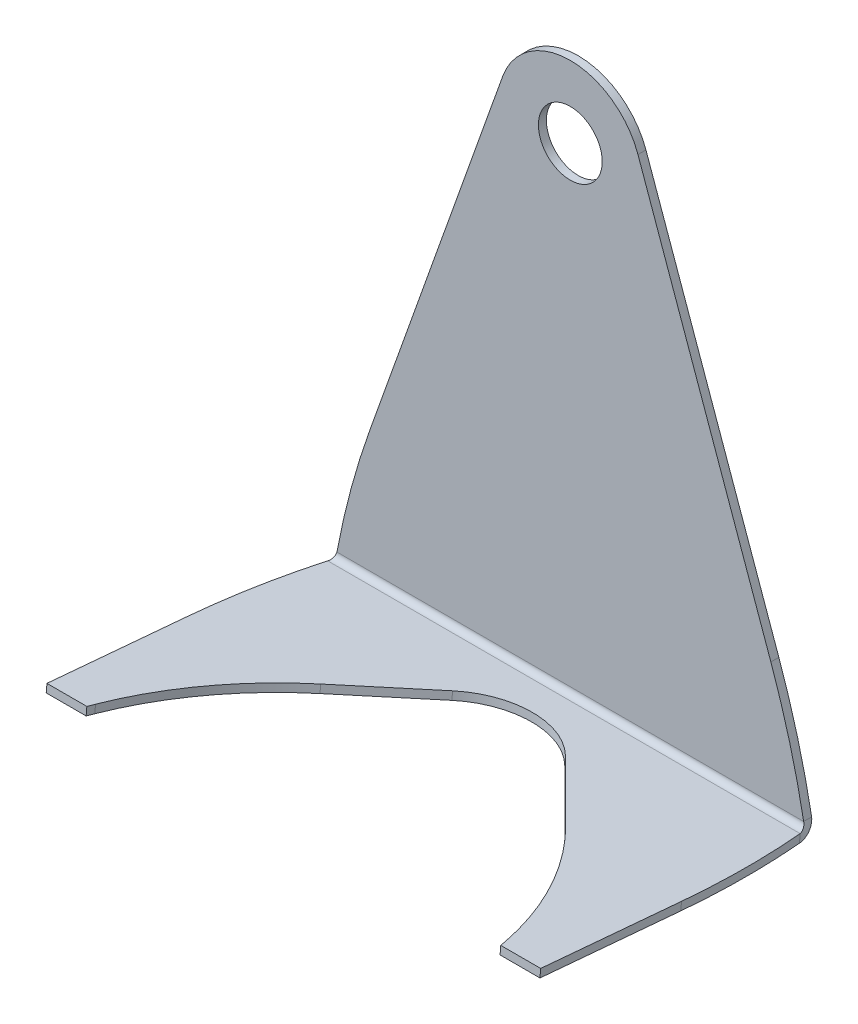
ISO-10303-21;
HEADER;
FILE_DESCRIPTION(('STEP AP214'),'2;1');
FILE_NAME('part.step','',(''),(''),'','','');
FILE_SCHEMA(('AUTOMOTIVE_DESIGN { 1 0 10303 214 1 1 1 1 }'));
ENDSEC;
DATA;
#1=APPLICATION_CONTEXT('core data for automotive mechanical design processes');
#2=APPLICATION_PROTOCOL_DEFINITION('international standard','automotive_design',2000,#1);
#3=PRODUCT_CONTEXT('',#1,'mechanical');
#4=PRODUCT('Part','Part','',(#3));
#5=PRODUCT_RELATED_PRODUCT_CATEGORY('part','',(#4));
#6=PRODUCT_DEFINITION_FORMATION('','',#4);
#7=PRODUCT_DEFINITION_CONTEXT('part definition',#1,'design');
#8=PRODUCT_DEFINITION('design','',#6,#7);
#9=PRODUCT_DEFINITION_SHAPE('','',#8);
#10=(LENGTH_UNIT() NAMED_UNIT(*) SI_UNIT(.MILLI.,.METRE.));
#11=(NAMED_UNIT(*) PLANE_ANGLE_UNIT() SI_UNIT($,.RADIAN.));
#12=(NAMED_UNIT(*) SI_UNIT($,.STERADIAN.) SOLID_ANGLE_UNIT());
#13=UNCERTAINTY_MEASURE_WITH_UNIT(LENGTH_MEASURE(1.E-05),#10,'distance_accuracy_value','');
#14=(GEOMETRIC_REPRESENTATION_CONTEXT(3) GLOBAL_UNCERTAINTY_ASSIGNED_CONTEXT((#13)) GLOBAL_UNIT_ASSIGNED_CONTEXT((#10,
#11,#12)) REPRESENTATION_CONTEXT('',''));
#15=CARTESIAN_POINT('',(0.,0.,0.));
#16=DIRECTION('',(0.,0.,1.));
#17=DIRECTION('',(1.,0.,0.));
#18=AXIS2_PLACEMENT_3D('',#15,#16,#17);
#19=CARTESIAN_POINT('',(0.,-65.0273117005495,-59.9921620678218));
#20=DIRECTION('',(0.,0.996194698091745,-0.0871557427476618));
#21=DIRECTION('',(1.,0.,0.));
#22=AXIS2_PLACEMENT_3D('',#19,#20,#21);
#23=PLANE('',#22);
#24=CARTESIAN_POINT('',(-69.0664990067316,-58.2915841524877,16.9975561036726));
#25=DIRECTION('',(0.,0.996194698091745,-0.0871557427476618));
#26=DIRECTION('',(1.,0.,0.));
#27=AXIS2_PLACEMENT_3D('',#24,#25,#26);
#28=CIRCLE('',#27,100.);
#29=CARTESIAN_POINT('',(30.9335009932684,-58.2915841524876,16.9975561036726));
#30=VERTEX_POINT('',#29);
#31=CARTESIAN_POINT('',(29.6029343312348,-59.7086167919317,0.80079892010794));
#32=VERTEX_POINT('',#31);
#33=EDGE_CURVE('E76',#30,#32,#28,.T.);
#34=ORIENTED_EDGE('',*,*,#33,.T.);
#35=DIRECTION('',(-1.,0.,0.));
#36=VECTOR('',#35,1.);
#37=CARTESIAN_POINT('',(0.,-59.7086167919317,0.800798920107933));
#38=LINE('',#37,#36);
#39=CARTESIAN_POINT('',(-29.6029343312348,-59.7086167919317,0.800798920107926));
#40=VERTEX_POINT('',#39);
#41=EDGE_CURVE('E69',#32,#40,#38,.T.);
#42=ORIENTED_EDGE('',*,*,#41,.T.);
#43=CARTESIAN_POINT('',(69.0664990067316,-58.2915841524876,16.9975561036726));
#44=DIRECTION('',(0.,0.996194698091745,-0.0871557427476618));
#45=DIRECTION('',(1.,0.,0.));
#46=AXIS2_PLACEMENT_3D('',#43,#44,#45);
#47=CIRCLE('',#46,100.);
#48=CARTESIAN_POINT('',(-30.9335009932684,-58.2915841524877,16.9975561036725));
#49=VERTEX_POINT('',#48);
#50=EDGE_CURVE('E83',#40,#49,#47,.T.);
#51=ORIENTED_EDGE('',*,*,#50,.T.);
#52=DIRECTION('',(0.,0.0871557427476618,0.996194698091745));
#53=VECTOR('',#52,1.);
#54=CARTESIAN_POINT('',(-30.9335009932684,-59.7979671356898,-0.220480182317087));
#55=LINE('',#54,#53);
#56=CARTESIAN_POINT('',(-30.9335009932684,-56.7475161395217,34.646334250894));
#57=VERTEX_POINT('',#56);
#58=EDGE_CURVE('E433',#49,#57,#55,.T.);
#59=ORIENTED_EDGE('',*,*,#58,.T.);
#60=DIRECTION('',(1.,0.,0.));
#61=VECTOR('',#60,1.);
#62=CARTESIAN_POINT('',(-30.9335009932684,-56.7475161395217,34.646334250894));
#63=LINE('',#62,#61);
#64=CARTESIAN_POINT('',(-25.9335009932684,-56.7475161395217,34.646334250894));
#65=VERTEX_POINT('',#64);
#66=EDGE_CURVE('E435',#57,#65,#63,.T.);
#67=ORIENTED_EDGE('',*,*,#66,.T.);
#68=DIRECTION('',(0.258819045102519,-0.0841859828293726,-0.962250186899058));
#69=VECTOR('',#68,1.);
#70=CARTESIAN_POINT('',(-25.9335009932684,-56.7475161395217,34.646334250894));
#71=LINE('',#70,#69);
#72=CARTESIAN_POINT('',(-25.702946352975,-56.8225085690057,33.7891668595807));
#73=VERTEX_POINT('',#72);
#74=EDGE_CURVE('E438',#65,#73,#71,.T.);
#75=ORIENTED_EDGE('',*,*,#74,.T.);
#76=CARTESIAN_POINT('',(12.9340866985877,-55.9202059244796,44.1025332794326));
#77=DIRECTION('',(0.,0.996194698091745,-0.0871557427476618));
#78=DIRECTION('',(1.,0.,0.));
#79=AXIS2_PLACEMENT_3D('',#76,#77,#78);
#80=CIRCLE('',#79,40.);
#81=CARTESIAN_POINT('',(-15.3501845488743,-58.3853425931285,15.9258922233223));
#82=VERTEX_POINT('',#81);
#83=EDGE_CURVE('E487',#73,#82,#80,.F.);
#84=ORIENTED_EDGE('',*,*,#83,.T.);
#85=DIRECTION('',(0.707106781186546,-0.0616284167162219,-0.70441602640276));
#86=VECTOR('',#85,1.);
#87=CARTESIAN_POINT('',(-7.07106781186549,-59.1069151616371,7.67828002503152));
#88=LINE('',#87,#86);
#89=CARTESIAN_POINT('',(-7.07106781186549,-59.1069151616371,7.67828002503152));
#90=VERTEX_POINT('',#89);
#91=EDGE_CURVE('E441',#82,#90,#88,.T.);
#92=ORIENTED_EDGE('',*,*,#91,.T.);
#93=CARTESIAN_POINT('',(0.,-58.4906309944749,14.7224402890591));
#94=DIRECTION('',(0.,-0.996194698091745,0.0871557427476618));
#95=DIRECTION('',(1.,0.,0.));
#96=AXIS2_PLACEMENT_3D('',#93,#94,#95);
#97=CIRCLE('',#96,10.);
#98=CARTESIAN_POINT('',(7.07106781186549,-59.1069151616371,7.67828002503152));
#99=VERTEX_POINT('',#98);
#100=EDGE_CURVE('E443',#90,#99,#97,.T.);
#101=ORIENTED_EDGE('',*,*,#100,.T.);
#102=DIRECTION('',(0.707106781186546,0.0616284167162222,0.70441602640276));
#103=VECTOR('',#102,1.);
#104=CARTESIAN_POINT('',(22.9289321881345,-57.7248112135317,23.4758004397287));
#105=LINE('',#104,#103);
#106=CARTESIAN_POINT('',(15.3501845488743,-58.3853425931285,15.9258922233223));
#107=VERTEX_POINT('',#106);
#108=EDGE_CURVE('E446',#99,#107,#105,.T.);
#109=ORIENTED_EDGE('',*,*,#108,.T.);
#110=CARTESIAN_POINT('',(-12.9340866985877,-55.9202059244796,44.1025332794326));
#111=DIRECTION('',(0.,0.996194698091745,-0.0871557427476618));
#112=DIRECTION('',(1.,0.,0.));
#113=AXIS2_PLACEMENT_3D('',#110,#111,#112);
#114=CIRCLE('',#113,40.);
#115=CARTESIAN_POINT('',(25.702946352975,-56.8225085690056,33.7891668595807));
#116=VERTEX_POINT('',#115);
#117=EDGE_CURVE('E483',#107,#116,#114,.F.);
#118=ORIENTED_EDGE('',*,*,#117,.T.);
#119=DIRECTION('',(0.258819045102519,0.0841859828293728,0.962250186899058));
#120=VECTOR('',#119,1.);
#121=CARTESIAN_POINT('',(22.9289321881345,-57.7248112135317,23.4758004397287));
#122=LINE('',#121,#120);
#123=CARTESIAN_POINT('',(25.9335009932684,-56.7475161395216,34.646334250894));
#124=VERTEX_POINT('',#123);
#125=EDGE_CURVE('E449',#116,#124,#122,.T.);
#126=ORIENTED_EDGE('',*,*,#125,.T.);
#127=DIRECTION('',(1.,0.,0.));
#128=VECTOR('',#127,1.);
#129=CARTESIAN_POINT('',(25.9335009932684,-56.7475161395216,34.646334250894));
#130=LINE('',#129,#128);
#131=CARTESIAN_POINT('',(30.9335009932684,-56.7475161395216,34.646334250894));
#132=VERTEX_POINT('',#131);
#133=EDGE_CURVE('E451',#124,#132,#130,.T.);
#134=ORIENTED_EDGE('',*,*,#133,.T.);
#135=DIRECTION('',(0.,-0.0871557427476618,-0.996194698091745));
#136=VECTOR('',#135,1.);
#137=CARTESIAN_POINT('',(30.9335009932684,-56.7475161395216,34.646334250894));
#138=LINE('',#137,#136);
#139=EDGE_CURVE('E410',#132,#30,#138,.T.);
#140=ORIENTED_EDGE('',*,*,#139,.T.);
#141=EDGE_LOOP('',(#34,#42,#51,#59,#67,#75,#84,#92,#101,#109,#118,#126,#134,#140));
#142=FACE_BOUND('',#141,.T.);
#143=ADVANCED_FACE('F57',(#142),#23,.T.);
#144=CARTESIAN_POINT('',(69.0664990067316,-59.2877788505794,17.0847118464202));
#145=DIRECTION('',(0.,0.996194698091745,-0.0871557427476618));
#146=DIRECTION('',(1.,0.,0.));
#147=AXIS2_PLACEMENT_3D('',#144,#145,#146);
#148=CYLINDRICAL_SURFACE('',#147,100.);
#149=ORIENTED_EDGE('',*,*,#50,.F.);
#150=CARTESIAN_POINT('',(-29.6029343312348,-60.7048114900234,0.887954662855561));
#151=CARTESIAN_POINT('',(-29.6029343312348,-59.7086167919317,0.800798920107916));
#152=B_SPLINE_CURVE_WITH_KNOTS('',1,(#150,#151),.UNSPECIFIED.,.F.,.F.,(2,2),(0.,1.),.UNSPECIFIED.);
#153=CARTESIAN_POINT('',(-29.6029343312348,-60.7048114900234,0.887954662855592));
#154=VERTEX_POINT('',#153);
#155=EDGE_CURVE('E196',#40,#154,#152,.F.);
#156=ORIENTED_EDGE('',*,*,#155,.T.);
#157=CARTESIAN_POINT('',(69.0664990067316,-59.2877788505794,17.0847118464202));
#158=DIRECTION('',(0.,0.996194698091745,-0.0871557427476618));
#159=DIRECTION('',(1.,0.,0.));
#160=AXIS2_PLACEMENT_3D('',#157,#158,#159);
#161=CIRCLE('',#160,100.);
#162=CARTESIAN_POINT('',(-30.9335009932684,-59.2877788505794,17.0847118464202));
#163=VERTEX_POINT('',#162);
#164=EDGE_CURVE('E199',#163,#154,#161,.F.);
#165=ORIENTED_EDGE('',*,*,#164,.F.);
#166=DIRECTION('',(0.,0.996194698091745,-0.0871557427476618));
#167=VECTOR('',#166,1.);
#168=CARTESIAN_POINT('',(-30.9335009932684,-59.2877788505794,17.0847118464202));
#169=LINE('',#168,#167);
#170=EDGE_CURVE('E469',#49,#163,#169,.F.);
#171=ORIENTED_EDGE('',*,*,#170,.F.);
#172=EDGE_LOOP('',(#149,#156,#165,#171));
#173=FACE_BOUND('',#172,.T.);
#174=ADVANCED_FACE('F198',(#173),#148,.T.);
#175=CARTESIAN_POINT('',(-69.0664990067316,-59.2877788505794,17.0847118464202));
#176=DIRECTION('',(0.,0.996194698091745,-0.0871557427476618));
#177=DIRECTION('',(1.,0.,0.));
#178=AXIS2_PLACEMENT_3D('',#175,#176,#177);
#179=CYLINDRICAL_SURFACE('',#178,100.);
#180=CARTESIAN_POINT('',(-69.0664990067316,-59.2877788505794,17.0847118464202));
#181=DIRECTION('',(0.,0.996194698091745,-0.0871557427476618));
#182=DIRECTION('',(1.,0.,0.));
#183=AXIS2_PLACEMENT_3D('',#180,#181,#182);
#184=CIRCLE('',#183,100.);
#185=CARTESIAN_POINT('',(29.6029343312348,-60.7048114900234,0.887954662855586));
#186=VERTEX_POINT('',#185);
#187=CARTESIAN_POINT('',(30.9335009932684,-59.2877788505794,17.0847118464202));
#188=VERTEX_POINT('',#187);
#189=EDGE_CURVE('E215',#186,#188,#184,.F.);
#190=ORIENTED_EDGE('',*,*,#189,.F.);
#191=CARTESIAN_POINT('',(29.6029343312348,-59.7086167919317,0.800798920107929));
#192=CARTESIAN_POINT('',(29.6029343312348,-60.7048114900234,0.887954662855592));
#193=B_SPLINE_CURVE_WITH_KNOTS('',1,(#191,#192),.UNSPECIFIED.,.F.,.F.,(2,2),(0.,1.),.UNSPECIFIED.);
#194=EDGE_CURVE('E12',#186,#32,#193,.F.);
#195=ORIENTED_EDGE('',*,*,#194,.T.);
#196=ORIENTED_EDGE('',*,*,#33,.F.);
#197=DIRECTION('',(0.,0.996194698091745,-0.0871557427476618));
#198=VECTOR('',#197,1.);
#199=CARTESIAN_POINT('',(30.9335009932684,-59.2877788505794,17.0847118464202));
#200=LINE('',#199,#198);
#201=EDGE_CURVE('E214',#188,#30,#200,.T.);
#202=ORIENTED_EDGE('',*,*,#201,.F.);
#203=EDGE_LOOP('',(#190,#195,#196,#202));
#204=FACE_BOUND('',#203,.T.);
#205=ADVANCED_FACE('F59',(#204),#179,.T.);
#206=CARTESIAN_POINT('',(30.9335009932684,-57.7437108376134,34.7334899936417));
#207=DIRECTION('',(1.,0.,0.));
#208=DIRECTION('',(0.,-0.996194698091745,0.0871557427476618));
#209=AXIS2_PLACEMENT_3D('',#206,#207,#208);
#210=PLANE('',#209);
#211=DIRECTION('',(0.,-0.0871557427476618,-0.996194698091745));
#212=VECTOR('',#211,1.);
#213=CARTESIAN_POINT('',(30.9335009932684,-57.7437108376134,34.7334899936417));
#214=LINE('',#213,#212);
#215=CARTESIAN_POINT('',(30.9335009932684,-57.7437108376134,34.7334899936417));
#216=VERTEX_POINT('',#215);
#217=EDGE_CURVE('E429',#216,#188,#214,.T.);
#218=ORIENTED_EDGE('',*,*,#217,.T.);
#219=ORIENTED_EDGE('',*,*,#201,.T.);
#220=ORIENTED_EDGE('',*,*,#139,.F.);
#221=DIRECTION('',(0.,0.996194698091745,-0.0871557427476618));
#222=VECTOR('',#221,1.);
#223=CARTESIAN_POINT('',(30.9335009932684,-57.7437108376134,34.7334899936417));
#224=LINE('',#223,#222);
#225=EDGE_CURVE('E455',#216,#132,#224,.T.);
#226=ORIENTED_EDGE('',*,*,#225,.F.);
#227=EDGE_LOOP('',(#218,#219,#220,#226));
#228=FACE_BOUND('',#227,.T.);
#229=ADVANCED_FACE('F392',(#228),#210,.T.);
#230=CARTESIAN_POINT('',(25.9335009932684,-57.7437108376134,34.7334899936417));
#231=DIRECTION('',(0.,0.0871557427476618,0.996194698091745));
#232=DIRECTION('',(1.,0.,0.));
#233=AXIS2_PLACEMENT_3D('',#230,#231,#232);
#234=PLANE('',#233);
#235=ORIENTED_EDGE('',*,*,#133,.F.);
#236=DIRECTION('',(0.,0.996194698091745,-0.0871557427476618));
#237=VECTOR('',#236,1.);
#238=CARTESIAN_POINT('',(25.9335009932684,-57.7437108376134,34.7334899936417));
#239=LINE('',#238,#237);
#240=CARTESIAN_POINT('',(25.9335009932684,-57.7437108376134,34.7334899936417));
#241=VERTEX_POINT('',#240);
#242=EDGE_CURVE('E457',#241,#124,#239,.T.);
#243=ORIENTED_EDGE('',*,*,#242,.F.);
#244=DIRECTION('',(1.,0.,0.));
#245=VECTOR('',#244,1.);
#246=CARTESIAN_POINT('',(25.9335009932684,-57.7437108376134,34.7334899936417));
#247=LINE('',#246,#245);
#248=EDGE_CURVE('E426',#241,#216,#247,.T.);
#249=ORIENTED_EDGE('',*,*,#248,.T.);
#250=ORIENTED_EDGE('',*,*,#225,.T.);
#251=EDGE_LOOP('',(#235,#243,#249,#250));
#252=FACE_BOUND('',#251,.T.);
#253=ADVANCED_FACE('F558',(#252),#234,.T.);
#254=CARTESIAN_POINT('',(22.9289321881345,-58.7210059116234,23.5629561824764));
#255=DIRECTION('',(-0.965925826289069,0.0225575661131504,0.257834160496298));
#256=DIRECTION('',(0.258819045102519,0.0841859828293728,0.962250186899058));
#257=AXIS2_PLACEMENT_3D('',#254,#255,#256);
#258=PLANE('',#257);
#259=ORIENTED_EDGE('',*,*,#125,.F.);
#260=DIRECTION('',(0.,0.996194698091745,-0.0871557427476618));
#261=VECTOR('',#260,1.);
#262=CARTESIAN_POINT('',(25.702946352975,-57.8187032670974,33.8763226023283));
#263=LINE('',#262,#261);
#264=CARTESIAN_POINT('',(25.702946352975,-57.8187032670974,33.8763226023283));
#265=VERTEX_POINT('',#264);
#266=EDGE_CURVE('E476',#116,#265,#263,.F.);
#267=ORIENTED_EDGE('',*,*,#266,.T.);
#268=DIRECTION('',(0.258819045102519,0.0841859828293728,0.962250186899058));
#269=VECTOR('',#268,1.);
#270=CARTESIAN_POINT('',(22.9289321881345,-58.7210059116234,23.5629561824764));
#271=LINE('',#270,#269);
#272=EDGE_CURVE('E424',#265,#241,#271,.T.);
#273=ORIENTED_EDGE('',*,*,#272,.T.);
#274=ORIENTED_EDGE('',*,*,#242,.T.);
#275=EDGE_LOOP('',(#259,#267,#273,#274));
#276=FACE_BOUND('',#275,.T.);
#277=ADVANCED_FACE('F552',(#276),#258,.T.);
#278=CARTESIAN_POINT('',(22.9289321881345,-58.7210059116234,23.5629561824764));
#279=DIRECTION('',(-0.70710678118655,0.0616284167162216,0.704416026402757));
#280=DIRECTION('',(0.707106781186546,0.0616284167162222,0.70441602640276));
#281=AXIS2_PLACEMENT_3D('',#278,#279,#280);
#282=PLANE('',#281);
#283=DIRECTION('',(0.707106781186546,0.0616284167162222,0.70441602640276));
#284=VECTOR('',#283,1.);
#285=CARTESIAN_POINT('',(22.9289321881345,-58.7210059116234,23.5629561824764));
#286=LINE('',#285,#284);
#287=CARTESIAN_POINT('',(7.07106781186549,-60.1031098597288,7.76543576777918));
#288=VERTEX_POINT('',#287);
#289=CARTESIAN_POINT('',(15.3501845488743,-59.3815372912202,16.01304796607));
#290=VERTEX_POINT('',#289);
#291=EDGE_CURVE('E421',#288,#290,#286,.T.);
#292=ORIENTED_EDGE('',*,*,#291,.T.);
#293=DIRECTION('',(0.,0.996194698091745,-0.0871557427476618));
#294=VECTOR('',#293,1.);
#295=CARTESIAN_POINT('',(15.3501845488743,-58.3853425931285,15.9258922233223));
#296=LINE('',#295,#294);
#297=EDGE_CURVE('E473',#290,#107,#296,.T.);
#298=ORIENTED_EDGE('',*,*,#297,.T.);
#299=ORIENTED_EDGE('',*,*,#108,.F.);
#300=DIRECTION('',(0.,0.996194698091745,-0.0871557427476618));
#301=VECTOR('',#300,1.);
#302=CARTESIAN_POINT('',(7.07106781186549,-60.1031098597288,7.76543576777918));
#303=LINE('',#302,#301);
#304=EDGE_CURVE('E460',#288,#99,#303,.T.);
#305=ORIENTED_EDGE('',*,*,#304,.F.);
#306=EDGE_LOOP('',(#292,#298,#299,#305));
#307=FACE_BOUND('',#306,.T.);
#308=ADVANCED_FACE('F544',(#307),#282,.T.);
#309=CARTESIAN_POINT('',(0.,-59.4868256925666,14.8095960318068));
#310=DIRECTION('',(0.,0.996194698091745,-0.0871557427476618));
#311=DIRECTION('',(1.,0.,0.));
#312=AXIS2_PLACEMENT_3D('',#309,#310,#311);
#313=CYLINDRICAL_SURFACE('',#312,10.);
#314=ORIENTED_EDGE('',*,*,#100,.F.);
#315=DIRECTION('',(0.,0.996194698091745,-0.0871557427476618));
#316=VECTOR('',#315,1.);
#317=CARTESIAN_POINT('',(-7.07106781186549,-60.1031098597288,7.76543576777918));
#318=LINE('',#317,#316);
#319=CARTESIAN_POINT('',(-7.07106781186549,-60.1031098597288,7.76543576777918));
#320=VERTEX_POINT('',#319);
#321=EDGE_CURVE('E462',#320,#90,#318,.T.);
#322=ORIENTED_EDGE('',*,*,#321,.F.);
#323=CARTESIAN_POINT('',(0.,-59.4868256925666,14.8095960318068));
#324=DIRECTION('',(0.,-0.996194698091745,0.0871557427476618));
#325=DIRECTION('',(1.,0.,0.));
#326=AXIS2_PLACEMENT_3D('',#323,#324,#325);
#327=CIRCLE('',#326,10.);
#328=EDGE_CURVE('E418',#320,#288,#327,.T.);
#329=ORIENTED_EDGE('',*,*,#328,.T.);
#330=ORIENTED_EDGE('',*,*,#304,.T.);
#331=EDGE_LOOP('',(#314,#322,#329,#330));
#332=FACE_BOUND('',#331,.T.);
#333=ADVANCED_FACE('F540',(#332),#313,.F.);
#334=CARTESIAN_POINT('',(-7.07106781186549,-60.1031098597288,7.76543576777918));
#335=DIRECTION('',(0.707106781186549,0.0616284167162219,0.704416026402757));
#336=DIRECTION('',(0.707106781186546,-0.0616284167162219,-0.70441602640276));
#337=AXIS2_PLACEMENT_3D('',#334,#335,#336);
#338=PLANE('',#337);
#339=ORIENTED_EDGE('',*,*,#91,.F.);
#340=DIRECTION('',(0.,0.996194698091745,-0.0871557427476618));
#341=VECTOR('',#340,1.);
#342=CARTESIAN_POINT('',(-15.3501845488743,-59.3815372912202,16.01304796607));
#343=LINE('',#342,#341);
#344=CARTESIAN_POINT('',(-15.3501845488743,-59.3815372912202,16.01304796607));
#345=VERTEX_POINT('',#344);
#346=EDGE_CURVE('E481',#82,#345,#343,.F.);
#347=ORIENTED_EDGE('',*,*,#346,.T.);
#348=DIRECTION('',(0.707106781186546,-0.0616284167162219,-0.70441602640276));
#349=VECTOR('',#348,1.);
#350=CARTESIAN_POINT('',(-7.07106781186549,-60.1031098597288,7.76543576777918));
#351=LINE('',#350,#349);
#352=EDGE_CURVE('E416',#345,#320,#351,.T.);
#353=ORIENTED_EDGE('',*,*,#352,.T.);
#354=ORIENTED_EDGE('',*,*,#321,.T.);
#355=EDGE_LOOP('',(#339,#347,#353,#354));
#356=FACE_BOUND('',#355,.T.);
#357=ADVANCED_FACE('F534',(#356),#338,.T.);
#358=CARTESIAN_POINT('',(-25.9335009932684,-57.7437108376134,34.7334899936417));
#359=DIRECTION('',(0.965925826289069,0.0225575661131509,0.257834160496298));
#360=DIRECTION('',(0.258819045102519,-0.0841859828293726,-0.962250186899058));
#361=AXIS2_PLACEMENT_3D('',#358,#359,#360);
#362=PLANE('',#361);
#363=DIRECTION('',(0.258819045102519,-0.0841859828293726,-0.962250186899058));
#364=VECTOR('',#363,1.);
#365=CARTESIAN_POINT('',(-25.9335009932684,-57.7437108376134,34.7334899936417));
#366=LINE('',#365,#364);
#367=CARTESIAN_POINT('',(-25.9335009932684,-57.7437108376134,34.7334899936417));
#368=VERTEX_POINT('',#367);
#369=CARTESIAN_POINT('',(-25.702946352975,-57.8187032670974,33.8763226023284));
#370=VERTEX_POINT('',#369);
#371=EDGE_CURVE('E413',#368,#370,#366,.T.);
#372=ORIENTED_EDGE('',*,*,#371,.T.);
#373=DIRECTION('',(0.,0.996194698091745,-0.0871557427476618));
#374=VECTOR('',#373,1.);
#375=CARTESIAN_POINT('',(-25.7029463529751,-56.8225085690057,33.7891668595807));
#376=LINE('',#375,#374);
#377=EDGE_CURVE('E478',#370,#73,#376,.T.);
#378=ORIENTED_EDGE('',*,*,#377,.T.);
#379=ORIENTED_EDGE('',*,*,#74,.F.);
#380=DIRECTION('',(0.,0.996194698091745,-0.0871557427476618));
#381=VECTOR('',#380,1.);
#382=CARTESIAN_POINT('',(-25.9335009932684,-57.7437108376134,34.7334899936417));
#383=LINE('',#382,#381);
#384=EDGE_CURVE('E465',#368,#65,#383,.T.);
#385=ORIENTED_EDGE('',*,*,#384,.F.);
#386=EDGE_LOOP('',(#372,#378,#379,#385));
#387=FACE_BOUND('',#386,.T.);
#388=ADVANCED_FACE('F525',(#387),#362,.T.);
#389=CARTESIAN_POINT('',(-30.9335009932684,-57.7437108376134,34.7334899936416));
#390=DIRECTION('',(0.,0.0871557427476618,0.996194698091745));
#391=DIRECTION('',(0.,-0.996194698091745,0.0871557427476618));
#392=AXIS2_PLACEMENT_3D('',#389,#390,#391);
#393=PLANE('',#392);
#394=ORIENTED_EDGE('',*,*,#66,.F.);
#395=DIRECTION('',(0.,0.996194698091745,-0.0871557427476618));
#396=VECTOR('',#395,1.);
#397=CARTESIAN_POINT('',(-30.9335009932684,-57.7437108376134,34.7334899936416));
#398=LINE('',#397,#396);
#399=CARTESIAN_POINT('',(-30.9335009932684,-57.7437108376134,34.7334899936416));
#400=VERTEX_POINT('',#399);
#401=EDGE_CURVE('E432',#400,#57,#398,.T.);
#402=ORIENTED_EDGE('',*,*,#401,.F.);
#403=DIRECTION('',(1.,0.,0.));
#404=VECTOR('',#403,1.);
#405=CARTESIAN_POINT('',(-30.9335009932684,-57.7437108376134,34.7334899936416));
#406=LINE('',#405,#404);
#407=EDGE_CURVE('E409',#400,#368,#406,.T.);
#408=ORIENTED_EDGE('',*,*,#407,.T.);
#409=ORIENTED_EDGE('',*,*,#384,.T.);
#410=EDGE_LOOP('',(#394,#402,#408,#409));
#411=FACE_BOUND('',#410,.T.);
#412=ADVANCED_FACE('F521',(#411),#393,.T.);
#413=CARTESIAN_POINT('',(-30.9335009932684,-60.7941618337816,-0.133324439569427));
#414=DIRECTION('',(-1.,0.,0.));
#415=DIRECTION('',(0.,0.0871557427476618,0.996194698091745));
#416=AXIS2_PLACEMENT_3D('',#413,#414,#415);
#417=PLANE('',#416);
#418=ORIENTED_EDGE('',*,*,#58,.F.);
#419=ORIENTED_EDGE('',*,*,#170,.T.);
#420=DIRECTION('',(0.,0.0871557427476618,0.996194698091745));
#421=VECTOR('',#420,1.);
#422=CARTESIAN_POINT('',(-30.9335009932684,-60.7941618337816,-0.133324439569427));
#423=LINE('',#422,#421);
#424=EDGE_CURVE('E213',#163,#400,#423,.T.);
#425=ORIENTED_EDGE('',*,*,#424,.T.);
#426=ORIENTED_EDGE('',*,*,#401,.T.);
#427=EDGE_LOOP('',(#418,#419,#425,#426));
#428=FACE_BOUND('',#427,.T.);
#429=ADVANCED_FACE('F517',(#428),#417,.T.);
#430=CARTESIAN_POINT('',(0.,-66.0235063986413,-59.9050063250741));
#431=DIRECTION('',(0.,0.996194698091745,-0.0871557427476618));
#432=DIRECTION('',(1.,0.,0.));
#433=AXIS2_PLACEMENT_3D('',#430,#431,#432);
#434=PLANE('',#433);
#435=DIRECTION('',(-1.,0.,0.));
#436=VECTOR('',#435,1.);
#437=CARTESIAN_POINT('',(0.,-60.7048114900234,0.887954662855586));
#438=LINE('',#437,#436);
#439=EDGE_CURVE('E205',#186,#154,#438,.T.);
#440=ORIENTED_EDGE('',*,*,#439,.F.);
#441=ORIENTED_EDGE('',*,*,#189,.T.);
#442=ORIENTED_EDGE('',*,*,#217,.F.);
#443=ORIENTED_EDGE('',*,*,#248,.F.);
#444=ORIENTED_EDGE('',*,*,#272,.F.);
#445=CARTESIAN_POINT('',(-12.9340866985877,-56.9164006225714,44.1896890221803));
#446=DIRECTION('',(0.,0.996194698091745,-0.0871557427476618));
#447=DIRECTION('',(1.,0.,0.));
#448=AXIS2_PLACEMENT_3D('',#445,#446,#447);
#449=CIRCLE('',#448,40.);
#450=EDGE_CURVE('E485',#265,#290,#449,.T.);
#451=ORIENTED_EDGE('',*,*,#450,.T.);
#452=ORIENTED_EDGE('',*,*,#291,.F.);
#453=ORIENTED_EDGE('',*,*,#328,.F.);
#454=ORIENTED_EDGE('',*,*,#352,.F.);
#455=CARTESIAN_POINT('',(12.9340866985877,-56.9164006225714,44.1896890221803));
#456=DIRECTION('',(0.,0.996194698091745,-0.0871557427476618));
#457=DIRECTION('',(1.,0.,0.));
#458=AXIS2_PLACEMENT_3D('',#455,#456,#457);
#459=CIRCLE('',#458,40.);
#460=EDGE_CURVE('E227',#345,#370,#459,.T.);
#461=ORIENTED_EDGE('',*,*,#460,.T.);
#462=ORIENTED_EDGE('',*,*,#371,.F.);
#463=ORIENTED_EDGE('',*,*,#407,.F.);
#464=ORIENTED_EDGE('',*,*,#424,.F.);
#465=ORIENTED_EDGE('',*,*,#164,.T.);
#466=EDGE_LOOP('',(#440,#441,#442,#443,#444,#451,#452,#453,#454,#461,#462,#463,#464,#465));
#467=FACE_BOUND('',#466,.T.);
#468=ADVANCED_FACE('F210',(#467),#434,.F.);
#469=CARTESIAN_POINT('',(-12.9340866985877,-56.9164006225714,44.1896890221803));
#470=DIRECTION('',(0.,-0.996194698091745,0.0871557427476618));
#471=DIRECTION('',(-1.,0.,0.));
#472=AXIS2_PLACEMENT_3D('',#469,#470,#471);
#473=CYLINDRICAL_SURFACE('',#472,40.);
#474=ORIENTED_EDGE('',*,*,#450,.F.);
#475=ORIENTED_EDGE('',*,*,#266,.F.);
#476=ORIENTED_EDGE('',*,*,#117,.F.);
#477=ORIENTED_EDGE('',*,*,#297,.F.);
#478=EDGE_LOOP('',(#474,#475,#476,#477));
#479=FACE_BOUND('',#478,.T.);
#480=ADVANCED_FACE('F548',(#479),#473,.F.);
#481=CARTESIAN_POINT('',(12.9340866985877,-56.9164006225714,44.1896890221803));
#482=DIRECTION('',(0.,-0.996194698091745,0.0871557427476618));
#483=DIRECTION('',(-1.,0.,0.));
#484=AXIS2_PLACEMENT_3D('',#481,#482,#483);
#485=CYLINDRICAL_SURFACE('',#484,40.);
#486=ORIENTED_EDGE('',*,*,#460,.F.);
#487=ORIENTED_EDGE('',*,*,#346,.F.);
#488=ORIENTED_EDGE('',*,*,#83,.F.);
#489=ORIENTED_EDGE('',*,*,#377,.F.);
#490=EDGE_LOOP('',(#486,#487,#488,#489));
#491=FACE_BOUND('',#490,.T.);
#492=ADVANCED_FACE('F530',(#491),#485,.F.);
#493=CARTESIAN_POINT('',(30.9335009932684,-60.,-1.));
#494=DIRECTION('',(0.941987028632835,0.335649278097663,0.));
#495=DIRECTION('',(-0.335649278097663,0.941987028632835,0.));
#496=AXIS2_PLACEMENT_3D('',#493,#494,#495);
#497=PLANE('',#496);
#498=DIRECTION('',(-0.335649278097663,0.941987028632835,0.));
#499=VECTOR('',#498,1.);
#500=CARTESIAN_POINT('',(30.9335009932684,-60.,0.));
#501=LINE('',#500,#499);
#502=CARTESIAN_POINT('',(25.1322038565519,-43.7188785776513,0.));
#503=VERTEX_POINT('',#502);
#504=CARTESIAN_POINT('',(8.4778832576955,3.02084350287896,0.));
#505=VERTEX_POINT('',#504);
#506=EDGE_CURVE('E326',#503,#505,#501,.T.);
#507=ORIENTED_EDGE('',*,*,#506,.F.);
#508=DIRECTION('',(0.,0.,1.));
#509=VECTOR('',#508,1.);
#510=CARTESIAN_POINT('',(25.1322038565519,-43.7188785776513,-1.));
#511=LINE('',#510,#509);
#512=CARTESIAN_POINT('',(25.1322038565519,-43.7188785776513,-1.));
#513=VERTEX_POINT('',#512);
#514=EDGE_CURVE('E352',#503,#513,#511,.F.);
#515=ORIENTED_EDGE('',*,*,#514,.T.);
#516=DIRECTION('',(-0.335649278097663,0.941987028632835,0.));
#517=VECTOR('',#516,1.);
#518=CARTESIAN_POINT('',(30.9335009932684,-60.,-1.));
#519=LINE('',#518,#517);
#520=CARTESIAN_POINT('',(8.4778832576955,3.02084350287896,-1.));
#521=VERTEX_POINT('',#520);
#522=EDGE_CURVE('E350',#513,#521,#519,.T.);
#523=ORIENTED_EDGE('',*,*,#522,.T.);
#524=DIRECTION('',(0.,0.,1.));
#525=VECTOR('',#524,1.);
#526=CARTESIAN_POINT('',(8.4778832576955,3.02084350287896,-1.));
#527=LINE('',#526,#525);
#528=EDGE_CURVE('E347',#521,#505,#527,.T.);
#529=ORIENTED_EDGE('',*,*,#528,.T.);
#530=EDGE_LOOP('',(#507,#515,#523,#529));
#531=FACE_BOUND('',#530,.T.);
#532=ADVANCED_FACE('F576',(#531),#497,.T.);
#533=CARTESIAN_POINT('',(0.,0.,-1.));
#534=DIRECTION('',(0.,0.,1.));
#535=DIRECTION('',(1.,0.,0.));
#536=AXIS2_PLACEMENT_3D('',#533,#534,#535);
#537=CYLINDRICAL_SURFACE('',#536,8.99999999999999);
#538=CARTESIAN_POINT('',(0.,0.,0.));
#539=DIRECTION('',(0.,0.,1.));
#540=DIRECTION('',(1.,0.,0.));
#541=AXIS2_PLACEMENT_3D('',#538,#539,#540);
#542=CIRCLE('',#541,8.99999999999999);
#543=CARTESIAN_POINT('',(-8.47788325769551,3.02084350287896,0.));
#544=VERTEX_POINT('',#543);
#545=EDGE_CURVE('E323',#505,#544,#542,.T.);
#546=ORIENTED_EDGE('',*,*,#545,.F.);
#547=ORIENTED_EDGE('',*,*,#528,.F.);
#548=CARTESIAN_POINT('',(0.,0.,-1.));
#549=DIRECTION('',(0.,0.,1.));
#550=DIRECTION('',(1.,0.,0.));
#551=AXIS2_PLACEMENT_3D('',#548,#549,#550);
#552=CIRCLE('',#551,8.99999999999999);
#553=CARTESIAN_POINT('',(-8.47788325769551,3.02084350287896,-1.));
#554=VERTEX_POINT('',#553);
#555=EDGE_CURVE('E344',#521,#554,#552,.T.);
#556=ORIENTED_EDGE('',*,*,#555,.T.);
#557=DIRECTION('',(0.,0.,1.));
#558=VECTOR('',#557,1.);
#559=CARTESIAN_POINT('',(-8.47788325769551,3.02084350287896,-1.));
#560=LINE('',#559,#558);
#561=EDGE_CURVE('E342',#554,#544,#560,.T.);
#562=ORIENTED_EDGE('',*,*,#561,.T.);
#563=EDGE_LOOP('',(#546,#547,#556,#562));
#564=FACE_BOUND('',#563,.T.);
#565=ADVANCED_FACE('F643',(#564),#537,.T.);
#566=CARTESIAN_POINT('',(-8.47788325769551,3.02084350287896,-1.));
#567=DIRECTION('',(-0.941987028632835,0.335649278097663,0.));
#568=DIRECTION('',(-0.335649278097663,-0.941987028632835,0.));
#569=AXIS2_PLACEMENT_3D('',#566,#567,#568);
#570=PLANE('',#569);
#571=DIRECTION('',(-0.335649278097663,-0.941987028632835,0.));
#572=VECTOR('',#571,1.);
#573=CARTESIAN_POINT('',(-8.47788325769551,3.02084350287896,-1.));
#574=LINE('',#573,#572);
#575=CARTESIAN_POINT('',(-25.1322038565519,-43.7188785776513,-1.));
#576=VERTEX_POINT('',#575);
#577=EDGE_CURVE('E339',#554,#576,#574,.T.);
#578=ORIENTED_EDGE('',*,*,#577,.T.);
#579=DIRECTION('',(0.,0.,1.));
#580=VECTOR('',#579,1.);
#581=CARTESIAN_POINT('',(-25.1322038565519,-43.7188785776513,-1.));
#582=LINE('',#581,#580);
#583=CARTESIAN_POINT('',(-25.1322038565519,-43.7188785776513,0.));
#584=VERTEX_POINT('',#583);
#585=EDGE_CURVE('E336',#576,#584,#582,.T.);
#586=ORIENTED_EDGE('',*,*,#585,.T.);
#587=DIRECTION('',(-0.335649278097663,-0.941987028632835,0.));
#588=VECTOR('',#587,1.);
#589=CARTESIAN_POINT('',(-8.47788325769551,3.02084350287896,0.));
#590=LINE('',#589,#588);
#591=EDGE_CURVE('E314',#544,#584,#590,.T.);
#592=ORIENTED_EDGE('',*,*,#591,.F.);
#593=ORIENTED_EDGE('',*,*,#561,.F.);
#594=EDGE_LOOP('',(#578,#586,#592,#593));
#595=FACE_BOUND('',#594,.T.);
#596=ADVANCED_FACE('F650',(#595),#570,.T.);
#597=CARTESIAN_POINT('',(0.,0.,-1.));
#598=DIRECTION('',(0.,0.,1.));
#599=DIRECTION('',(1.,0.,0.));
#600=AXIS2_PLACEMENT_3D('',#597,#598,#599);
#601=CYLINDRICAL_SURFACE('',#600,4.);
#602=CARTESIAN_POINT('',(0.,0.,-1.));
#603=DIRECTION('',(0.,0.,1.));
#604=DIRECTION('',(1.,0.,0.));
#605=AXIS2_PLACEMENT_3D('',#602,#603,#604);
#606=CIRCLE('',#605,4.);
#607=CARTESIAN_POINT('',(4.,0.,-1.));
#608=VERTEX_POINT('',#607);
#609=EDGE_CURVE('E329',#608,#608,#606,.T.);
#610=ORIENTED_EDGE('',*,*,#609,.F.);
#611=EDGE_LOOP('',(#610));
#612=FACE_BOUND('',#611,.T.);
#613=CARTESIAN_POINT('',(0.,0.,0.));
#614=DIRECTION('',(0.,0.,1.));
#615=DIRECTION('',(1.,0.,0.));
#616=AXIS2_PLACEMENT_3D('',#613,#614,#615);
#617=CIRCLE('',#616,4.);
#618=CARTESIAN_POINT('',(4.,0.,0.));
#619=VERTEX_POINT('',#618);
#620=EDGE_CURVE('E333',#619,#619,#617,.T.);
#621=ORIENTED_EDGE('',*,*,#620,.T.);
#622=EDGE_LOOP('',(#621));
#623=FACE_BOUND('',#622,.T.);
#624=ADVANCED_FACE('F658',(#612,#623),#601,.F.);
#625=CARTESIAN_POINT('',(0.,0.,-1.));
#626=DIRECTION('',(0.,0.,1.));
#627=DIRECTION('',(1.,0.,0.));
#628=AXIS2_PLACEMENT_3D('',#625,#626,#627);
#629=PLANE('',#628);
#630=ORIENTED_EDGE('',*,*,#609,.T.);
#631=EDGE_LOOP('',(#630));
#632=FACE_BOUND('',#631,.T.);
#633=CARTESIAN_POINT('',(-69.0664990067316,-77.2838063874176,-1.));
#634=DIRECTION('',(0.,0.,1.));
#635=DIRECTION('',(1.,0.,0.));
#636=AXIS2_PLACEMENT_3D('',#633,#634,#635);
#637=CIRCLE('',#636,100.);
#638=CARTESIAN_POINT('',(29.2431190848426,-58.9748197773173,-1.));
#639=VERTEX_POINT('',#638);
#640=EDGE_CURVE('E332',#513,#639,#637,.F.);
#641=ORIENTED_EDGE('',*,*,#640,.T.);
#642=DIRECTION('',(-1.,0.,0.));
#643=VECTOR('',#642,1.);
#644=CARTESIAN_POINT('',(0.,-58.9748197773173,-1.));
#645=LINE('',#644,#643);
#646=CARTESIAN_POINT('',(-29.2431190848426,-58.9748197773173,-1.));
#647=VERTEX_POINT('',#646);
#648=EDGE_CURVE('E356',#639,#647,#645,.T.);
#649=ORIENTED_EDGE('',*,*,#648,.T.);
#650=CARTESIAN_POINT('',(69.0664990067316,-77.2838063874176,-1.));
#651=DIRECTION('',(0.,0.,1.));
#652=DIRECTION('',(1.,0.,0.));
#653=AXIS2_PLACEMENT_3D('',#650,#651,#652);
#654=CIRCLE('',#653,100.);
#655=EDGE_CURVE('E354',#647,#576,#654,.F.);
#656=ORIENTED_EDGE('',*,*,#655,.T.);
#657=ORIENTED_EDGE('',*,*,#577,.F.);
#658=ORIENTED_EDGE('',*,*,#555,.F.);
#659=ORIENTED_EDGE('',*,*,#522,.F.);
#660=EDGE_LOOP('',(#641,#649,#656,#657,#658,#659));
#661=FACE_BOUND('',#660,.T.);
#662=ADVANCED_FACE('F382',(#632,#661),#629,.F.);
#663=CARTESIAN_POINT('',(69.0664990067316,-77.2838063874176,-1.));
#664=DIRECTION('',(0.,0.,1.));
#665=DIRECTION('',(1.,0.,0.));
#666=AXIS2_PLACEMENT_3D('',#663,#664,#665);
#667=CYLINDRICAL_SURFACE('',#666,100.);
#668=CARTESIAN_POINT('',(-29.2431190848426,-58.9748197773173,0.));
#669=CARTESIAN_POINT('',(-29.2431190848426,-58.9748197773173,-1.));
#670=B_SPLINE_CURVE_WITH_KNOTS('',1,(#668,#669),.UNSPECIFIED.,.F.,.F.,(2,2),(0.,1.),.UNSPECIFIED.);
#671=CARTESIAN_POINT('',(-29.2431190848426,-58.9748197773173,0.));
#672=VERTEX_POINT('',#671);
#673=EDGE_CURVE('E233',#672,#647,#670,.T.);
#674=ORIENTED_EDGE('',*,*,#673,.F.);
#675=CARTESIAN_POINT('',(69.0664990067316,-77.2838063874176,0.));
#676=DIRECTION('',(0.,0.,1.));
#677=DIRECTION('',(1.,0.,0.));
#678=AXIS2_PLACEMENT_3D('',#675,#676,#677);
#679=CIRCLE('',#678,100.);
#680=EDGE_CURVE('E322',#584,#672,#679,.T.);
#681=ORIENTED_EDGE('',*,*,#680,.F.);
#682=ORIENTED_EDGE('',*,*,#585,.F.);
#683=ORIENTED_EDGE('',*,*,#655,.F.);
#684=EDGE_LOOP('',(#674,#681,#682,#683));
#685=FACE_BOUND('',#684,.T.);
#686=ADVANCED_FACE('F371',(#685),#667,.T.);
#687=CARTESIAN_POINT('',(0.,0.,0.));
#688=DIRECTION('',(0.,0.,1.));
#689=DIRECTION('',(1.,0.,0.));
#690=AXIS2_PLACEMENT_3D('',#687,#688,#689);
#691=PLANE('',#690);
#692=DIRECTION('',(-1.,0.,0.));
#693=VECTOR('',#692,1.);
#694=CARTESIAN_POINT('',(0.,-58.9748197773173,0.));
#695=LINE('',#694,#693);
#696=CARTESIAN_POINT('',(29.2431190848426,-58.9748197773173,0.));
#697=VERTEX_POINT('',#696);
#698=EDGE_CURVE('E369',#697,#672,#695,.T.);
#699=ORIENTED_EDGE('',*,*,#698,.F.);
#700=CARTESIAN_POINT('',(-69.0664990067316,-77.2838063874176,0.));
#701=DIRECTION('',(0.,0.,1.));
#702=DIRECTION('',(1.,0.,0.));
#703=AXIS2_PLACEMENT_3D('',#700,#701,#702);
#704=CIRCLE('',#703,100.);
#705=EDGE_CURVE('E328',#697,#503,#704,.T.);
#706=ORIENTED_EDGE('',*,*,#705,.T.);
#707=ORIENTED_EDGE('',*,*,#506,.T.);
#708=ORIENTED_EDGE('',*,*,#545,.T.);
#709=ORIENTED_EDGE('',*,*,#591,.T.);
#710=ORIENTED_EDGE('',*,*,#680,.T.);
#711=EDGE_LOOP('',(#699,#706,#707,#708,#709,#710));
#712=FACE_BOUND('',#711,.T.);
#713=ORIENTED_EDGE('',*,*,#620,.F.);
#714=EDGE_LOOP('',(#713));
#715=FACE_BOUND('',#714,.T.);
#716=ADVANCED_FACE('F381',(#712,#715),#691,.T.);
#717=CARTESIAN_POINT('',(-69.0664990067316,-77.2838063874176,-1.));
#718=DIRECTION('',(0.,0.,1.));
#719=DIRECTION('',(1.,0.,0.));
#720=AXIS2_PLACEMENT_3D('',#717,#718,#719);
#721=CYLINDRICAL_SURFACE('',#720,100.);
#722=CARTESIAN_POINT('',(29.2431190848426,-58.9748197773173,-1.));
#723=CARTESIAN_POINT('',(29.2431190848426,-58.9748197773173,0.));
#724=B_SPLINE_CURVE_WITH_KNOTS('',1,(#722,#723),.UNSPECIFIED.,.F.,.F.,(2,2),(0.,1.),.UNSPECIFIED.);
#725=EDGE_CURVE('E236',#639,#697,#724,.T.);
#726=ORIENTED_EDGE('',*,*,#725,.F.);
#727=ORIENTED_EDGE('',*,*,#640,.F.);
#728=ORIENTED_EDGE('',*,*,#514,.F.);
#729=ORIENTED_EDGE('',*,*,#705,.F.);
#730=EDGE_LOOP('',(#726,#727,#728,#729));
#731=FACE_BOUND('',#730,.T.);
#732=ADVANCED_FACE('F386',(#731),#721,.T.);
#733=CARTESIAN_POINT('',(29.2431190848426,-58.9748197773173,-1.));
#734=CARTESIAN_POINT('',(29.2731102902027,-59.2148219252347,-1.));
#735=CARTESIAN_POINT('',(29.3030882925746,-59.4546013119183,-0.94956870900479));
#736=CARTESIAN_POINT('',(29.3630575003067,-59.8938580459337,-0.756291120272872));
#737=CARTESIAN_POINT('',(29.3930421041727,-60.0930681895022,-0.613539150168205));
#738=CARTESIAN_POINT('',(29.4530113119047,-60.4172830113413,-0.2597207589225));
#739=CARTESIAN_POINT('',(29.4829959157707,-60.5421294590762,-0.048827016110275));
#740=CARTESIAN_POINT('',(29.5429651235028,-60.6963878213208,0.405603465219345));
#741=CARTESIAN_POINT('',(29.5729431258747,-60.7257290554862,0.648865795569647));
#742=CARTESIAN_POINT('',(29.6029343312348,-60.7048114900234,0.887954662855592));
#743=CARTESIAN_POINT('',(29.2431190848426,-58.9748197773173,0.));
#744=CARTESIAN_POINT('',(29.2731098578401,-59.0766181382294,0.));
#745=CARTESIAN_POINT('',(29.3030882925746,-59.1783249474124,0.0213910451152083));
#746=CARTESIAN_POINT('',(29.3630575003067,-59.3646410307221,0.103372083846022));
#747=CARTESIAN_POINT('',(29.3930421041727,-59.4491384347026,0.163922067249857));
#748=CARTESIAN_POINT('',(29.4530113119047,-59.5866580925206,0.313998438890756));
#749=CARTESIAN_POINT('',(29.4829959157707,-59.6396132309529,0.403451583515589));
#750=CARTESIAN_POINT('',(29.5429651235028,-59.7050437904539,0.596203796199798));
#751=CARTESIAN_POINT('',(29.5729435582372,-59.7174891036875,0.699387932692872));
#752=CARTESIAN_POINT('',(29.6029343312348,-59.7086167919317,0.800798920107929));
#753=B_SPLINE_SURFACE_WITH_KNOTS('',1,3,((#733,#734,#735,#736,#737,#738,#739,#740,#741,#742),
(#743,#744,#745,#746,#747,#748,#749,#750,#751,#752)),.UNSPECIFIED.,.F.,.F.,.F.,(2,2),(4,2,2,2,
4),(0.,1.),(0.,0.25,0.5,0.75,1.),.UNSPECIFIED.);
#754=CARTESIAN_POINT('',(29.2431190848426,-58.9748197773173,0.));
#755=CARTESIAN_POINT('',(29.2731098578401,-59.0766181382294,0.));
#756=CARTESIAN_POINT('',(29.3030882925746,-59.1783249474124,0.0213910451152083));
#757=CARTESIAN_POINT('',(29.3630575003067,-59.3646410307221,0.103372083846022));
#758=CARTESIAN_POINT('',(29.3930421041727,-59.4491384347026,0.163922067249857));
#759=CARTESIAN_POINT('',(29.4530113119047,-59.5866580925206,0.313998438890756));
#760=CARTESIAN_POINT('',(29.4829959157707,-59.6396132309529,0.403451583515589));
#761=CARTESIAN_POINT('',(29.5429651235028,-59.7050437904539,0.596203796199798));
#762=CARTESIAN_POINT('',(29.5729435582372,-59.7174891036875,0.699387932692872));
#763=CARTESIAN_POINT('',(29.6029343312348,-59.7086167919317,0.800798920107929));
#764=B_SPLINE_CURVE_WITH_KNOTS('',3,(#754,#755,#756,#757,#758,#759,#760,#761,#762,#763),
.UNSPECIFIED.,.F.,.F.,(4,2,2,2,4),(0.,0.25,0.5,0.75,1.),.UNSPECIFIED.);
#765=EDGE_CURVE('E823',#697,#32,#764,.T.);
#766=CARTESIAN_POINT('',(29.6029343312348,-60.7048114900234,0.887954662855592));
#767=CARTESIAN_POINT('',(29.5729431258747,-60.7257290554862,0.648865795569647));
#768=CARTESIAN_POINT('',(29.5429651235028,-60.6963878213208,0.405603465219345));
#769=CARTESIAN_POINT('',(29.4829959157707,-60.5421294590762,-0.048827016110275));
#770=CARTESIAN_POINT('',(29.4530113119047,-60.4172830113413,-0.2597207589225));
#771=CARTESIAN_POINT('',(29.3930421041727,-60.0930681895022,-0.613539150168205));
#772=CARTESIAN_POINT('',(29.3630575003067,-59.8938580459337,-0.756291120272872));
#773=CARTESIAN_POINT('',(29.3030882925746,-59.4546013119183,-0.94956870900479));
#774=CARTESIAN_POINT('',(29.2731102902027,-59.2148219252347,-1.));
#775=CARTESIAN_POINT('',(29.2431190848426,-58.9748197773173,-1.));
#776=B_SPLINE_CURVE_WITH_KNOTS('',3,(#766,#767,#768,#769,#770,#771,#772,#773,#774,#775),
.UNSPECIFIED.,.F.,.F.,(4,2,2,2,4),(0.,0.25,0.5,0.75,1.),.UNSPECIFIED.);
#777=EDGE_CURVE('E225',#639,#186,#776,.F.);
#778=ORIENTED_EDGE('',*,*,#725,.T.);
#779=ORIENTED_EDGE('',*,*,#765,.T.);
#780=ORIENTED_EDGE('',*,*,#194,.F.);
#781=ORIENTED_EDGE('',*,*,#777,.F.);
#782=EDGE_LOOP('',(#778,#779,#780,#781));
#783=FACE_BOUND('',#782,.T.);
#784=ADVANCED_FACE('F258',(#783),#753,.T.);
#785=CARTESIAN_POINT('',(-29.6029343312348,-60.7048114900234,0.887954662855561));
#786=CARTESIAN_POINT('',(-29.5729431258747,-60.7257290554862,0.648865795569617));
#787=CARTESIAN_POINT('',(-29.5429651235028,-60.6963878213208,0.405603465219316));
#788=CARTESIAN_POINT('',(-29.4829959157707,-60.5421294590762,-0.0488270161103009));
#789=CARTESIAN_POINT('',(-29.4530113119047,-60.4172830113413,-0.259720758922524));
#790=CARTESIAN_POINT('',(-29.3930421041727,-60.0930681895022,-0.613539150168223));
#791=CARTESIAN_POINT('',(-29.3630575003067,-59.8938580459337,-0.756291120272887));
#792=CARTESIAN_POINT('',(-29.3030882925746,-59.4546013119183,-0.949568709004798));
#793=CARTESIAN_POINT('',(-29.2731102902027,-59.2148219252347,-1.));
#794=CARTESIAN_POINT('',(-29.2431190848426,-58.9748197773173,-1.));
#795=CARTESIAN_POINT('',(-29.6029343312348,-59.7086167919317,0.800798920107916));
#796=CARTESIAN_POINT('',(-29.5729435582372,-59.7174891036875,0.699387932692859));
#797=CARTESIAN_POINT('',(-29.5429651235028,-59.7050437904539,0.596203796199786));
#798=CARTESIAN_POINT('',(-29.4829959157707,-59.6396132309529,0.403451583515577));
#799=CARTESIAN_POINT('',(-29.4530113119047,-59.5866580925206,0.313998438890746));
#800=CARTESIAN_POINT('',(-29.3930421041727,-59.4491384347026,0.163922067249849));
#801=CARTESIAN_POINT('',(-29.3630575003067,-59.3646410307221,0.103372083846016));
#802=CARTESIAN_POINT('',(-29.3030882925746,-59.1783249474124,0.0213910451152054));
#803=CARTESIAN_POINT('',(-29.2731098578401,-59.0766181382293,0.));
#804=CARTESIAN_POINT('',(-29.2431190848426,-58.9748197773173,0.));
#805=B_SPLINE_SURFACE_WITH_KNOTS('',1,3,((#785,#786,#787,#788,#789,#790,#791,#792,#793,#794),
(#795,#796,#797,#798,#799,#800,#801,#802,#803,#804)),.UNSPECIFIED.,.F.,.F.,.F.,(2,2),(4,2,2,2,
4),(0.,1.),(0.,0.25,0.5,0.75,1.),.UNSPECIFIED.);
#806=CARTESIAN_POINT('',(-29.6029343312348,-59.7086167919317,0.800798920107916));
#807=CARTESIAN_POINT('',(-29.5729435582372,-59.7174891036875,0.699387932692859));
#808=CARTESIAN_POINT('',(-29.5429651235028,-59.7050437904539,0.596203796199786));
#809=CARTESIAN_POINT('',(-29.4829959157707,-59.6396132309529,0.403451583515577));
#810=CARTESIAN_POINT('',(-29.4530113119047,-59.5866580925206,0.313998438890746));
#811=CARTESIAN_POINT('',(-29.3930421041727,-59.4491384347026,0.163922067249849));
#812=CARTESIAN_POINT('',(-29.3630575003067,-59.3646410307221,0.103372083846016));
#813=CARTESIAN_POINT('',(-29.3030882925746,-59.1783249474124,0.0213910451152054));
#814=CARTESIAN_POINT('',(-29.2731098578401,-59.0766181382293,0.));
#815=CARTESIAN_POINT('',(-29.2431190848426,-58.9748197773173,0.));
#816=B_SPLINE_CURVE_WITH_KNOTS('',3,(#806,#807,#808,#809,#810,#811,#812,#813,#814,#815),
.UNSPECIFIED.,.F.,.F.,(4,2,2,2,4),(0.,0.25,0.5,0.75,1.),.UNSPECIFIED.);
#817=EDGE_CURVE('E821',#40,#672,#816,.T.);
#818=CARTESIAN_POINT('',(-29.2431190848426,-58.9748197773173,-1.));
#819=CARTESIAN_POINT('',(-29.2731102902027,-59.2148219252347,-1.));
#820=CARTESIAN_POINT('',(-29.3030882925746,-59.4546013119183,-0.949568709004798));
#821=CARTESIAN_POINT('',(-29.3630575003067,-59.8938580459337,-0.756291120272887));
#822=CARTESIAN_POINT('',(-29.3930421041727,-60.0930681895022,-0.613539150168223));
#823=CARTESIAN_POINT('',(-29.4530113119047,-60.4172830113413,-0.259720758922524));
#824=CARTESIAN_POINT('',(-29.4829959157707,-60.5421294590762,-0.0488270161103009));
#825=CARTESIAN_POINT('',(-29.5429651235028,-60.6963878213208,0.405603465219316));
#826=CARTESIAN_POINT('',(-29.5729431258747,-60.7257290554862,0.648865795569617));
#827=CARTESIAN_POINT('',(-29.6029343312348,-60.7048114900234,0.887954662855561));
#828=B_SPLINE_CURVE_WITH_KNOTS('',3,(#818,#819,#820,#821,#822,#823,#824,#825,#826,#827),
.UNSPECIFIED.,.F.,.F.,(4,2,2,2,4),(0.,0.25,0.5,0.75,1.),.UNSPECIFIED.);
#829=EDGE_CURVE('E222',#154,#647,#828,.F.);
#830=ORIENTED_EDGE('',*,*,#155,.F.);
#831=ORIENTED_EDGE('',*,*,#817,.T.);
#832=ORIENTED_EDGE('',*,*,#673,.T.);
#833=ORIENTED_EDGE('',*,*,#829,.F.);
#834=EDGE_LOOP('',(#830,#831,#832,#833));
#835=FACE_BOUND('',#834,.T.);
#836=ADVANCED_FACE('F231',(#835),#805,.T.);
#837=CARTESIAN_POINT('',(59.2498005231539,-58.9748197773173,0.7366));
#838=DIRECTION('',(-1.,0.,0.));
#839=DIRECTION('',(0.,-1.,0.));
#840=AXIS2_PLACEMENT_3D('',#837,#838,#839);
#841=CYLINDRICAL_SURFACE('',#840,1.7366);
#842=ORIENTED_EDGE('',*,*,#829,.T.);
#843=ORIENTED_EDGE('',*,*,#648,.F.);
#844=ORIENTED_EDGE('',*,*,#777,.T.);
#845=ORIENTED_EDGE('',*,*,#439,.T.);
#846=EDGE_LOOP('',(#842,#843,#844,#845));
#847=FACE_BOUND('',#846,.T.);
#848=ADVANCED_FACE('F220',(#847),#841,.T.);
#849=CARTESIAN_POINT('',(59.2498005231539,-58.9748197773173,0.7366));
#850=DIRECTION('',(-1.,0.,0.));
#851=DIRECTION('',(0.,-1.,0.));
#852=AXIS2_PLACEMENT_3D('',#849,#850,#851);
#853=CYLINDRICAL_SURFACE('',#852,0.7366);
#854=ORIENTED_EDGE('',*,*,#817,.F.);
#855=ORIENTED_EDGE('',*,*,#41,.F.);
#856=ORIENTED_EDGE('',*,*,#765,.F.);
#857=ORIENTED_EDGE('',*,*,#698,.T.);
#858=EDGE_LOOP('',(#854,#855,#856,#857));
#859=FACE_BOUND('',#858,.T.);
#860=ADVANCED_FACE('F259',(#859),#853,.F.);
#861=CLOSED_SHELL('',(#143,#174,#205,#229,#253,#277,#308,#333,#357,#388,#412,#429,#468,#480,
#492,#532,#565,#596,#624,#662,#686,#716,#732,#784,#836,#848,#860));
#862=MANIFOLD_SOLID_BREP('B2',#861);
#863=ADVANCED_BREP_SHAPE_REPRESENTATION('',(#18,#862),#14);
#864=SHAPE_DEFINITION_REPRESENTATION(#9,#863);
ENDSEC;
END-ISO-10303-21;
